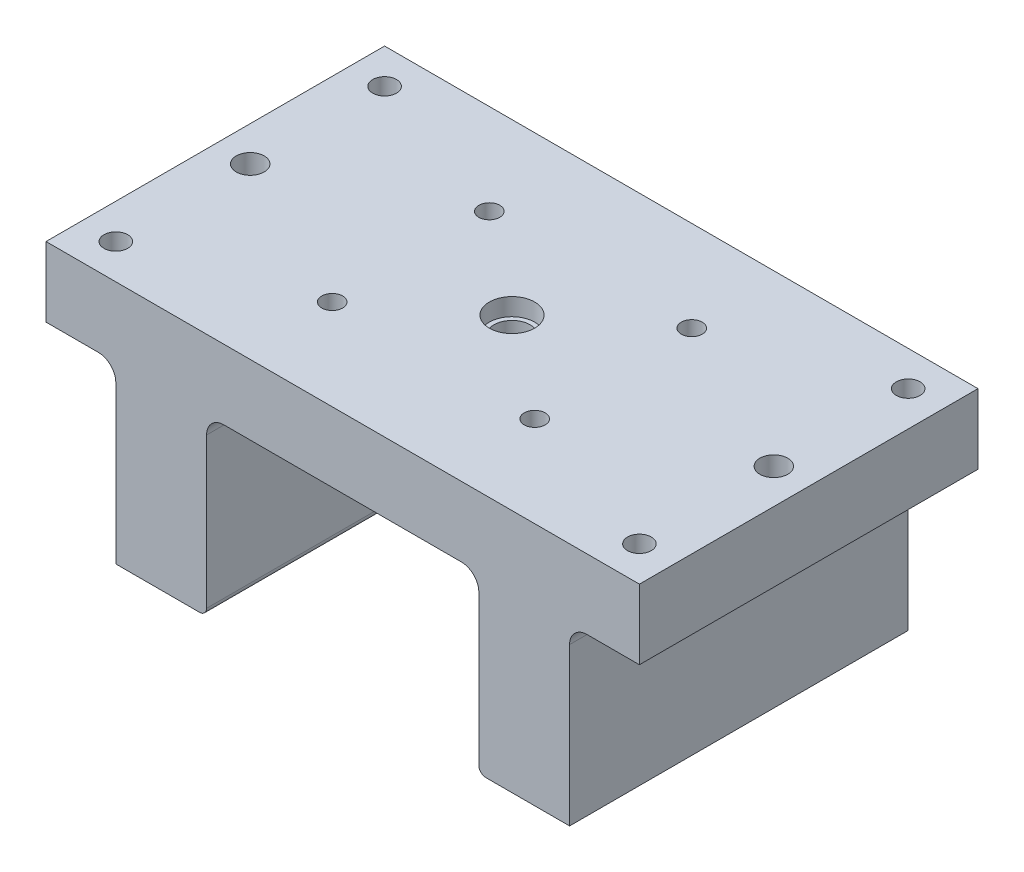
ISO-10303-21;
HEADER;
FILE_DESCRIPTION(('STEP AP214'),'2;1');
FILE_NAME('part.step','',(''),(''),'','','');
FILE_SCHEMA(('AUTOMOTIVE_DESIGN { 1 0 10303 214 1 1 1 1 }'));
ENDSEC;
DATA;
#1=APPLICATION_CONTEXT('core data for automotive mechanical design processes');
#2=APPLICATION_PROTOCOL_DEFINITION('international standard','automotive_design',2000,#1);
#3=PRODUCT_CONTEXT('',#1,'mechanical');
#4=PRODUCT('Part','Part','',(#3));
#5=PRODUCT_RELATED_PRODUCT_CATEGORY('part','',(#4));
#6=PRODUCT_DEFINITION_FORMATION('','',#4);
#7=PRODUCT_DEFINITION_CONTEXT('part definition',#1,'design');
#8=PRODUCT_DEFINITION('design','',#6,#7);
#9=PRODUCT_DEFINITION_SHAPE('','',#8);
#10=(LENGTH_UNIT() NAMED_UNIT(*) SI_UNIT(.MILLI.,.METRE.));
#11=(NAMED_UNIT(*) PLANE_ANGLE_UNIT() SI_UNIT($,.RADIAN.));
#12=(NAMED_UNIT(*) SI_UNIT($,.STERADIAN.) SOLID_ANGLE_UNIT());
#13=UNCERTAINTY_MEASURE_WITH_UNIT(LENGTH_MEASURE(1.E-05),#10,'distance_accuracy_value','');
#14=(GEOMETRIC_REPRESENTATION_CONTEXT(3) GLOBAL_UNCERTAINTY_ASSIGNED_CONTEXT((#13)) GLOBAL_UNIT_ASSIGNED_CONTEXT((#10,
#11,#12)) REPRESENTATION_CONTEXT('',''));
#15=CARTESIAN_POINT('',(0.,0.,0.));
#16=DIRECTION('',(0.,0.,1.));
#17=DIRECTION('',(1.,0.,0.));
#18=AXIS2_PLACEMENT_3D('',#15,#16,#17);
#19=CARTESIAN_POINT('',(65.,70.,48.5));
#20=DIRECTION('',(-1.,0.,0.));
#21=DIRECTION('',(0.,0.,1.));
#22=AXIS2_PLACEMENT_3D('',#19,#20,#21);
#23=PLANE('',#22);
#24=DIRECTION('',(0.,-1.,0.));
#25=VECTOR('',#24,1.);
#26=CARTESIAN_POINT('',(65.,70.,-48.5));
#27=LINE('',#26,#25);
#28=CARTESIAN_POINT('',(65.,45.,-48.5));
#29=VERTEX_POINT('',#28);
#30=CARTESIAN_POINT('',(65.,0.,-48.5));
#31=VERTEX_POINT('',#30);
#32=EDGE_CURVE('E331',#29,#31,#27,.T.);
#33=ORIENTED_EDGE('',*,*,#32,.F.);
#34=DIRECTION('',(0.,0.,-1.));
#35=VECTOR('',#34,1.);
#36=CARTESIAN_POINT('',(65.,45.,48.5));
#37=LINE('',#36,#35);
#38=CARTESIAN_POINT('',(65.,45.,48.5));
#39=VERTEX_POINT('',#38);
#40=EDGE_CURVE('E406',#29,#39,#37,.F.);
#41=ORIENTED_EDGE('',*,*,#40,.T.);
#42=DIRECTION('',(0.,-1.,0.));
#43=VECTOR('',#42,1.);
#44=CARTESIAN_POINT('',(65.,70.,48.5));
#45=LINE('',#44,#43);
#46=CARTESIAN_POINT('',(65.,0.,48.5));
#47=VERTEX_POINT('',#46);
#48=EDGE_CURVE('E334',#39,#47,#45,.T.);
#49=ORIENTED_EDGE('',*,*,#48,.T.);
#50=DIRECTION('',(0.,0.,-1.));
#51=VECTOR('',#50,1.);
#52=CARTESIAN_POINT('',(65.,0.,48.5));
#53=LINE('',#52,#51);
#54=EDGE_CURVE('E314',#47,#31,#53,.T.);
#55=ORIENTED_EDGE('',*,*,#54,.T.);
#56=EDGE_LOOP('',(#33,#41,#49,#55));
#57=FACE_BOUND('',#56,.T.);
#58=ADVANCED_FACE('F53',(#57),#23,.F.);
#59=CARTESIAN_POINT('',(0.,0.,0.));
#60=DIRECTION('',(0.,1.,0.));
#61=DIRECTION('',(0.,0.,1.));
#62=AXIS2_PLACEMENT_3D('',#59,#60,#61);
#63=CYLINDRICAL_SURFACE('',#62,5.2);
#64=CARTESIAN_POINT('',(0.,50.,0.));
#65=DIRECTION('',(0.,1.,0.));
#66=DIRECTION('',(0.,0.,1.));
#67=AXIS2_PLACEMENT_3D('',#64,#65,#66);
#68=CIRCLE('',#67,5.2);
#69=CARTESIAN_POINT('',(0.,50.,5.2));
#70=VERTEX_POINT('',#69);
#71=EDGE_CURVE('E296',#70,#70,#68,.T.);
#72=ORIENTED_EDGE('',*,*,#71,.F.);
#73=EDGE_LOOP('',(#72));
#74=FACE_BOUND('',#73,.T.);
#75=CARTESIAN_POINT('',(0.,65.,0.));
#76=DIRECTION('',(0.,1.,0.));
#77=DIRECTION('',(0.,0.,1.));
#78=AXIS2_PLACEMENT_3D('',#75,#76,#77);
#79=CIRCLE('',#78,5.2);
#80=CARTESIAN_POINT('',(0.,65.,5.2));
#81=VERTEX_POINT('',#80);
#82=EDGE_CURVE('E274',#81,#81,#79,.F.);
#83=ORIENTED_EDGE('',*,*,#82,.F.);
#84=EDGE_LOOP('',(#83));
#85=FACE_BOUND('',#84,.T.);
#86=ADVANCED_FACE('F546',(#74,#85),#63,.F.);
#87=CARTESIAN_POINT('',(0.,0.,0.));
#88=DIRECTION('',(0.,1.,0.));
#89=DIRECTION('',(0.,0.,1.));
#90=AXIS2_PLACEMENT_3D('',#87,#88,#89);
#91=PLANE('',#90);
#92=DIRECTION('',(-1.,0.,0.));
#93=VECTOR('',#92,1.);
#94=CARTESIAN_POINT('',(-65.,0.,-48.5));
#95=LINE('',#94,#93);
#96=CARTESIAN_POINT('',(-41.,0.,-48.5));
#97=VERTEX_POINT('',#96);
#98=CARTESIAN_POINT('',(-65.,0.,-48.5));
#99=VERTEX_POINT('',#98);
#100=EDGE_CURVE('E318',#97,#99,#95,.T.);
#101=ORIENTED_EDGE('',*,*,#100,.F.);
#102=DIRECTION('',(0.,0.,1.));
#103=VECTOR('',#102,1.);
#104=CARTESIAN_POINT('',(-41.,0.,0.));
#105=LINE('',#104,#103);
#106=CARTESIAN_POINT('',(-41.,0.,48.5));
#107=VERTEX_POINT('',#106);
#108=EDGE_CURVE('E390',#97,#107,#105,.T.);
#109=ORIENTED_EDGE('',*,*,#108,.T.);
#110=DIRECTION('',(1.,0.,0.));
#111=VECTOR('',#110,1.);
#112=CARTESIAN_POINT('',(-65.,0.,48.5));
#113=LINE('',#112,#111);
#114=CARTESIAN_POINT('',(-65.,0.,48.5));
#115=VERTEX_POINT('',#114);
#116=EDGE_CURVE('E310',#115,#107,#113,.T.);
#117=ORIENTED_EDGE('',*,*,#116,.F.);
#118=DIRECTION('',(0.,0.,1.));
#119=VECTOR('',#118,1.);
#120=CARTESIAN_POINT('',(-65.,0.,48.5));
#121=LINE('',#120,#119);
#122=EDGE_CURVE('E306',#99,#115,#121,.T.);
#123=ORIENTED_EDGE('',*,*,#122,.F.);
#124=EDGE_LOOP('',(#101,#109,#117,#123));
#125=FACE_BOUND('',#124,.T.);
#126=ADVANCED_FACE('F521',(#125),#91,.F.);
#127=CARTESIAN_POINT('',(-65.,70.,48.5));
#128=DIRECTION('',(0.,0.,-1.));
#129=DIRECTION('',(-1.,0.,0.));
#130=AXIS2_PLACEMENT_3D('',#127,#128,#129);
#131=PLANE('',#130);
#132=DIRECTION('',(0.,1.,0.));
#133=VECTOR('',#132,1.);
#134=CARTESIAN_POINT('',(39.,0.,48.5));
#135=LINE('',#134,#133);
#136=CARTESIAN_POINT('',(39.,2.,48.5));
#137=VERTEX_POINT('',#136);
#138=CARTESIAN_POINT('',(39.,45.,48.5));
#139=VERTEX_POINT('',#138);
#140=EDGE_CURVE('E295',#137,#139,#135,.T.);
#141=ORIENTED_EDGE('',*,*,#140,.F.);
#142=CARTESIAN_POINT('',(41.,2.,48.5));
#143=DIRECTION('',(0.,0.,-1.));
#144=DIRECTION('',(-1.,0.,0.));
#145=AXIS2_PLACEMENT_3D('',#142,#143,#144);
#146=CIRCLE('',#145,2.);
#147=CARTESIAN_POINT('',(41.,0.,48.5));
#148=VERTEX_POINT('',#147);
#149=EDGE_CURVE('E378',#137,#148,#146,.F.);
#150=ORIENTED_EDGE('',*,*,#149,.T.);
#151=EDGE_CURVE('E290',#148,#47,#113,.T.);
#152=ORIENTED_EDGE('',*,*,#151,.T.);
#153=ORIENTED_EDGE('',*,*,#48,.F.);
#154=CARTESIAN_POINT('',(70.,45.,48.5));
#155=DIRECTION('',(0.,0.,-1.));
#156=DIRECTION('',(-1.,0.,0.));
#157=AXIS2_PLACEMENT_3D('',#154,#155,#156);
#158=CIRCLE('',#157,5.);
#159=CARTESIAN_POINT('',(70.,50.,48.5));
#160=VERTEX_POINT('',#159);
#161=EDGE_CURVE('E207',#39,#160,#158,.T.);
#162=ORIENTED_EDGE('',*,*,#161,.T.);
#163=DIRECTION('',(-1.,0.,0.));
#164=VECTOR('',#163,1.);
#165=CARTESIAN_POINT('',(65.,50.,48.5));
#166=LINE('',#165,#164);
#167=CARTESIAN_POINT('',(85.,50.,48.5));
#168=VERTEX_POINT('',#167);
#169=EDGE_CURVE('E184',#168,#160,#166,.T.);
#170=ORIENTED_EDGE('',*,*,#169,.F.);
#171=DIRECTION('',(0.,1.,0.));
#172=VECTOR('',#171,1.);
#173=CARTESIAN_POINT('',(85.,50.,48.5));
#174=LINE('',#173,#172);
#175=CARTESIAN_POINT('',(85.,70.,48.5));
#176=VERTEX_POINT('',#175);
#177=EDGE_CURVE('E195',#168,#176,#174,.T.);
#178=ORIENTED_EDGE('',*,*,#177,.T.);
#179=DIRECTION('',(1.,0.,0.));
#180=VECTOR('',#179,1.);
#181=CARTESIAN_POINT('',(-65.,70.,48.5));
#182=LINE('',#181,#180);
#183=CARTESIAN_POINT('',(-85.,70.,48.5));
#184=VERTEX_POINT('',#183);
#185=EDGE_CURVE('E302',#184,#176,#182,.T.);
#186=ORIENTED_EDGE('',*,*,#185,.F.);
#187=DIRECTION('',(0.,1.,0.));
#188=VECTOR('',#187,1.);
#189=CARTESIAN_POINT('',(-85.,50.,48.5));
#190=LINE('',#189,#188);
#191=CARTESIAN_POINT('',(-85.,50.,48.5));
#192=VERTEX_POINT('',#191);
#193=EDGE_CURVE('E236',#192,#184,#190,.T.);
#194=ORIENTED_EDGE('',*,*,#193,.F.);
#195=DIRECTION('',(1.,0.,0.));
#196=VECTOR('',#195,1.);
#197=CARTESIAN_POINT('',(-65.,50.,48.5));
#198=LINE('',#197,#196);
#199=CARTESIAN_POINT('',(-70.,50.,48.5));
#200=VERTEX_POINT('',#199);
#201=EDGE_CURVE('E229',#192,#200,#198,.T.);
#202=ORIENTED_EDGE('',*,*,#201,.T.);
#203=CARTESIAN_POINT('',(-70.,45.,48.5));
#204=DIRECTION('',(0.,0.,-1.));
#205=DIRECTION('',(-1.,0.,0.));
#206=AXIS2_PLACEMENT_3D('',#203,#204,#205);
#207=CIRCLE('',#206,5.);
#208=CARTESIAN_POINT('',(-65.,45.,48.5));
#209=VERTEX_POINT('',#208);
#210=EDGE_CURVE('E11',#200,#209,#207,.T.);
#211=ORIENTED_EDGE('',*,*,#210,.T.);
#212=DIRECTION('',(0.,-1.,0.));
#213=VECTOR('',#212,1.);
#214=CARTESIAN_POINT('',(-65.,70.,48.5));
#215=LINE('',#214,#213);
#216=EDGE_CURVE('E309',#209,#115,#215,.T.);
#217=ORIENTED_EDGE('',*,*,#216,.T.);
#218=ORIENTED_EDGE('',*,*,#116,.T.);
#219=CARTESIAN_POINT('',(-41.,2.,48.5));
#220=DIRECTION('',(0.,0.,-1.));
#221=DIRECTION('',(-1.,0.,0.));
#222=AXIS2_PLACEMENT_3D('',#219,#220,#221);
#223=CIRCLE('',#222,2.);
#224=CARTESIAN_POINT('',(-39.,2.,48.5));
#225=VERTEX_POINT('',#224);
#226=EDGE_CURVE('E375',#107,#225,#223,.F.);
#227=ORIENTED_EDGE('',*,*,#226,.T.);
#228=DIRECTION('',(0.,-1.,0.));
#229=VECTOR('',#228,1.);
#230=CARTESIAN_POINT('',(-39.,0.,48.5));
#231=LINE('',#230,#229);
#232=CARTESIAN_POINT('',(-39.,45.,48.5));
#233=VERTEX_POINT('',#232);
#234=EDGE_CURVE('E291',#233,#225,#231,.T.);
#235=ORIENTED_EDGE('',*,*,#234,.F.);
#236=CARTESIAN_POINT('',(-34.,45.,48.5));
#237=DIRECTION('',(0.,0.,-1.));
#238=DIRECTION('',(-1.,0.,0.));
#239=AXIS2_PLACEMENT_3D('',#236,#237,#238);
#240=CIRCLE('',#239,5.);
#241=CARTESIAN_POINT('',(-34.,50.,48.5));
#242=VERTEX_POINT('',#241);
#243=EDGE_CURVE('E359',#233,#242,#240,.T.);
#244=ORIENTED_EDGE('',*,*,#243,.T.);
#245=DIRECTION('',(-1.,0.,0.));
#246=VECTOR('',#245,1.);
#247=CARTESIAN_POINT('',(-39.,50.,48.5));
#248=LINE('',#247,#246);
#249=CARTESIAN_POINT('',(34.,50.,48.5));
#250=VERTEX_POINT('',#249);
#251=EDGE_CURVE('E283',#250,#242,#248,.T.);
#252=ORIENTED_EDGE('',*,*,#251,.F.);
#253=CARTESIAN_POINT('',(34.,45.,48.5));
#254=DIRECTION('',(0.,0.,-1.));
#255=DIRECTION('',(-1.,0.,0.));
#256=AXIS2_PLACEMENT_3D('',#253,#254,#255);
#257=CIRCLE('',#256,5.);
#258=EDGE_CURVE('E352',#250,#139,#257,.T.);
#259=ORIENTED_EDGE('',*,*,#258,.T.);
#260=EDGE_LOOP('',(#141,#150,#152,#153,#162,#170,#178,#186,#194,#202,#211,#217,#218,#227,#235,
#244,#252,#259));
#261=FACE_BOUND('',#260,.T.);
#262=ADVANCED_FACE('F204',(#261),#131,.F.);
#263=CARTESIAN_POINT('',(-65.,70.,-48.5));
#264=DIRECTION('',(0.,0.,1.));
#265=DIRECTION('',(1.,0.,0.));
#266=AXIS2_PLACEMENT_3D('',#263,#264,#265);
#267=PLANE('',#266);
#268=CARTESIAN_POINT('',(41.,0.,-48.5));
#269=VERTEX_POINT('',#268);
#270=EDGE_CURVE('E319',#31,#269,#95,.T.);
#271=ORIENTED_EDGE('',*,*,#270,.T.);
#272=CARTESIAN_POINT('',(41.,2.,-48.5));
#273=DIRECTION('',(0.,0.,1.));
#274=DIRECTION('',(1.,0.,0.));
#275=AXIS2_PLACEMENT_3D('',#272,#273,#274);
#276=CIRCLE('',#275,2.);
#277=CARTESIAN_POINT('',(39.,2.,-48.5));
#278=VERTEX_POINT('',#277);
#279=EDGE_CURVE('E387',#269,#278,#276,.F.);
#280=ORIENTED_EDGE('',*,*,#279,.T.);
#281=DIRECTION('',(0.,1.,0.));
#282=VECTOR('',#281,1.);
#283=CARTESIAN_POINT('',(39.,0.,-48.5));
#284=LINE('',#283,#282);
#285=CARTESIAN_POINT('',(39.,45.,-48.5));
#286=VERTEX_POINT('',#285);
#287=EDGE_CURVE('E282',#278,#286,#284,.T.);
#288=ORIENTED_EDGE('',*,*,#287,.T.);
#289=CARTESIAN_POINT('',(34.,45.,-48.5));
#290=DIRECTION('',(0.,0.,1.));
#291=DIRECTION('',(1.,0.,0.));
#292=AXIS2_PLACEMENT_3D('',#289,#290,#291);
#293=CIRCLE('',#292,5.);
#294=CARTESIAN_POINT('',(34.,50.,-48.5));
#295=VERTEX_POINT('',#294);
#296=EDGE_CURVE('E356',#286,#295,#293,.T.);
#297=ORIENTED_EDGE('',*,*,#296,.T.);
#298=DIRECTION('',(-1.,0.,0.));
#299=VECTOR('',#298,1.);
#300=CARTESIAN_POINT('',(-39.,50.,-48.5));
#301=LINE('',#300,#299);
#302=CARTESIAN_POINT('',(-34.,50.,-48.5));
#303=VERTEX_POINT('',#302);
#304=EDGE_CURVE('E286',#295,#303,#301,.T.);
#305=ORIENTED_EDGE('',*,*,#304,.T.);
#306=CARTESIAN_POINT('',(-34.,45.,-48.5));
#307=DIRECTION('',(0.,0.,1.));
#308=DIRECTION('',(1.,0.,0.));
#309=AXIS2_PLACEMENT_3D('',#306,#307,#308);
#310=CIRCLE('',#309,5.);
#311=CARTESIAN_POINT('',(-39.,45.,-48.5));
#312=VERTEX_POINT('',#311);
#313=EDGE_CURVE('E362',#303,#312,#310,.T.);
#314=ORIENTED_EDGE('',*,*,#313,.T.);
#315=DIRECTION('',(0.,-1.,0.));
#316=VECTOR('',#315,1.);
#317=CARTESIAN_POINT('',(-39.,0.,-48.5));
#318=LINE('',#317,#316);
#319=CARTESIAN_POINT('',(-39.,2.,-48.5));
#320=VERTEX_POINT('',#319);
#321=EDGE_CURVE('E278',#312,#320,#318,.T.);
#322=ORIENTED_EDGE('',*,*,#321,.T.);
#323=CARTESIAN_POINT('',(-41.,2.,-48.5));
#324=DIRECTION('',(0.,0.,1.));
#325=DIRECTION('',(1.,0.,0.));
#326=AXIS2_PLACEMENT_3D('',#323,#324,#325);
#327=CIRCLE('',#326,2.);
#328=EDGE_CURVE('E384',#320,#97,#327,.F.);
#329=ORIENTED_EDGE('',*,*,#328,.T.);
#330=ORIENTED_EDGE('',*,*,#100,.T.);
#331=DIRECTION('',(0.,-1.,0.));
#332=VECTOR('',#331,1.);
#333=CARTESIAN_POINT('',(-65.,70.,-48.5));
#334=LINE('',#333,#332);
#335=CARTESIAN_POINT('',(-65.,45.,-48.5));
#336=VERTEX_POINT('',#335);
#337=EDGE_CURVE('E328',#336,#99,#334,.T.);
#338=ORIENTED_EDGE('',*,*,#337,.F.);
#339=CARTESIAN_POINT('',(-70.,45.,-48.5));
#340=DIRECTION('',(0.,0.,1.));
#341=DIRECTION('',(1.,0.,0.));
#342=AXIS2_PLACEMENT_3D('',#339,#340,#341);
#343=CIRCLE('',#342,5.);
#344=CARTESIAN_POINT('',(-70.,50.,-48.5));
#345=VERTEX_POINT('',#344);
#346=EDGE_CURVE('E63',#336,#345,#343,.T.);
#347=ORIENTED_EDGE('',*,*,#346,.T.);
#348=DIRECTION('',(-1.,0.,0.));
#349=VECTOR('',#348,1.);
#350=CARTESIAN_POINT('',(-65.,50.,-48.5));
#351=LINE('',#350,#349);
#352=CARTESIAN_POINT('',(-85.,50.,-48.5));
#353=VERTEX_POINT('',#352);
#354=EDGE_CURVE('E222',#345,#353,#351,.T.);
#355=ORIENTED_EDGE('',*,*,#354,.T.);
#356=DIRECTION('',(0.,1.,0.));
#357=VECTOR('',#356,1.);
#358=CARTESIAN_POINT('',(-85.,50.,-48.5));
#359=LINE('',#358,#357);
#360=CARTESIAN_POINT('',(-85.,70.,-48.5));
#361=VERTEX_POINT('',#360);
#362=EDGE_CURVE('E232',#353,#361,#359,.T.);
#363=ORIENTED_EDGE('',*,*,#362,.T.);
#364=DIRECTION('',(-1.,0.,0.));
#365=VECTOR('',#364,1.);
#366=CARTESIAN_POINT('',(-65.,70.,-48.5));
#367=LINE('',#366,#365);
#368=CARTESIAN_POINT('',(85.,70.,-48.5));
#369=VERTEX_POINT('',#368);
#370=EDGE_CURVE('E305',#369,#361,#367,.T.);
#371=ORIENTED_EDGE('',*,*,#370,.F.);
#372=DIRECTION('',(0.,1.,0.));
#373=VECTOR('',#372,1.);
#374=CARTESIAN_POINT('',(85.,50.,-48.5));
#375=LINE('',#374,#373);
#376=CARTESIAN_POINT('',(85.,50.,-48.5));
#377=VERTEX_POINT('',#376);
#378=EDGE_CURVE('E201',#377,#369,#375,.T.);
#379=ORIENTED_EDGE('',*,*,#378,.F.);
#380=DIRECTION('',(1.,0.,0.));
#381=VECTOR('',#380,1.);
#382=CARTESIAN_POINT('',(65.,50.,-48.5));
#383=LINE('',#382,#381);
#384=CARTESIAN_POINT('',(70.,50.,-48.5));
#385=VERTEX_POINT('',#384);
#386=EDGE_CURVE('E187',#385,#377,#383,.T.);
#387=ORIENTED_EDGE('',*,*,#386,.F.);
#388=CARTESIAN_POINT('',(70.,45.,-48.5));
#389=DIRECTION('',(0.,0.,1.));
#390=DIRECTION('',(1.,0.,0.));
#391=AXIS2_PLACEMENT_3D('',#388,#389,#390);
#392=CIRCLE('',#391,5.);
#393=EDGE_CURVE('E415',#385,#29,#392,.T.);
#394=ORIENTED_EDGE('',*,*,#393,.T.);
#395=ORIENTED_EDGE('',*,*,#32,.T.);
#396=EDGE_LOOP('',(#271,#280,#288,#297,#305,#314,#322,#329,#330,#338,#347,#355,#363,#371,#379,
#387,#394,#395));
#397=FACE_BOUND('',#396,.T.);
#398=ADVANCED_FACE('F500',(#397),#267,.F.);
#399=CARTESIAN_POINT('',(-65.,70.,48.5));
#400=DIRECTION('',(1.,0.,0.));
#401=DIRECTION('',(0.,0.,-1.));
#402=AXIS2_PLACEMENT_3D('',#399,#400,#401);
#403=PLANE('',#402);
#404=ORIENTED_EDGE('',*,*,#216,.F.);
#405=DIRECTION('',(0.,0.,-1.));
#406=VECTOR('',#405,1.);
#407=CARTESIAN_POINT('',(-65.,45.,-48.5));
#408=LINE('',#407,#406);
#409=EDGE_CURVE('E409',#209,#336,#408,.T.);
#410=ORIENTED_EDGE('',*,*,#409,.T.);
#411=ORIENTED_EDGE('',*,*,#337,.T.);
#412=ORIENTED_EDGE('',*,*,#122,.T.);
#413=EDGE_LOOP('',(#404,#410,#411,#412));
#414=FACE_BOUND('',#413,.T.);
#415=ADVANCED_FACE('F514',(#414),#403,.F.);
#416=CARTESIAN_POINT('',(0.,70.,0.));
#417=DIRECTION('',(0.,1.,0.));
#418=DIRECTION('',(0.,0.,1.));
#419=AXIS2_PLACEMENT_3D('',#416,#417,#418);
#420=PLANE('',#419);
#421=CARTESIAN_POINT('',(-75.,70.,0.));
#422=DIRECTION('',(0.,1.,0.));
#423=DIRECTION('',(0.,0.,1.));
#424=AXIS2_PLACEMENT_3D('',#421,#422,#423);
#425=CIRCLE('',#424,4.);
#426=CARTESIAN_POINT('',(-75.,70.,4.00000000000001));
#427=VERTEX_POINT('',#426);
#428=EDGE_CURVE('E799',#427,#427,#425,.T.);
#429=ORIENTED_EDGE('',*,*,#428,.F.);
#430=EDGE_LOOP('',(#429));
#431=FACE_BOUND('',#430,.T.);
#432=CARTESIAN_POINT('',(75.,70.,0.));
#433=DIRECTION('',(0.,1.,0.));
#434=DIRECTION('',(0.,0.,1.));
#435=AXIS2_PLACEMENT_3D('',#432,#433,#434);
#436=CIRCLE('',#435,4.);
#437=CARTESIAN_POINT('',(75.,70.,4.00000000000001));
#438=VERTEX_POINT('',#437);
#439=EDGE_CURVE('E804',#438,#438,#436,.T.);
#440=ORIENTED_EDGE('',*,*,#439,.F.);
#441=EDGE_LOOP('',(#440));
#442=FACE_BOUND('',#441,.T.);
#443=CARTESIAN_POINT('',(-75.,70.,-38.5));
#444=DIRECTION('',(0.,1.,0.));
#445=DIRECTION('',(0.,0.,1.));
#446=AXIS2_PLACEMENT_3D('',#443,#444,#445);
#447=CIRCLE('',#446,3.4);
#448=CARTESIAN_POINT('',(-75.,70.,-35.1));
#449=VERTEX_POINT('',#448);
#450=EDGE_CURVE('E817',#449,#449,#447,.T.);
#451=ORIENTED_EDGE('',*,*,#450,.F.);
#452=EDGE_LOOP('',(#451));
#453=FACE_BOUND('',#452,.T.);
#454=CARTESIAN_POINT('',(-75.,70.,38.5));
#455=DIRECTION('',(0.,1.,0.));
#456=DIRECTION('',(0.,0.,1.));
#457=AXIS2_PLACEMENT_3D('',#454,#455,#456);
#458=CIRCLE('',#457,3.4);
#459=CARTESIAN_POINT('',(-75.,70.,41.9));
#460=VERTEX_POINT('',#459);
#461=EDGE_CURVE('E821',#460,#460,#458,.T.);
#462=ORIENTED_EDGE('',*,*,#461,.F.);
#463=EDGE_LOOP('',(#462));
#464=FACE_BOUND('',#463,.T.);
#465=CARTESIAN_POINT('',(75.,70.,38.5));
#466=DIRECTION('',(0.,1.,0.));
#467=DIRECTION('',(0.,0.,1.));
#468=AXIS2_PLACEMENT_3D('',#465,#466,#467);
#469=CIRCLE('',#468,3.4);
#470=CARTESIAN_POINT('',(75.,70.,41.9));
#471=VERTEX_POINT('',#470);
#472=EDGE_CURVE('E829',#471,#471,#469,.T.);
#473=ORIENTED_EDGE('',*,*,#472,.F.);
#474=EDGE_LOOP('',(#473));
#475=FACE_BOUND('',#474,.T.);
#476=CARTESIAN_POINT('',(75.,70.,-38.5));
#477=DIRECTION('',(0.,1.,0.));
#478=DIRECTION('',(0.,0.,1.));
#479=AXIS2_PLACEMENT_3D('',#476,#477,#478);
#480=CIRCLE('',#479,3.4);
#481=CARTESIAN_POINT('',(75.,70.,-35.1));
#482=VERTEX_POINT('',#481);
#483=EDGE_CURVE('E836',#482,#482,#480,.T.);
#484=ORIENTED_EDGE('',*,*,#483,.F.);
#485=EDGE_LOOP('',(#484));
#486=FACE_BOUND('',#485,.T.);
#487=CARTESIAN_POINT('',(-29.,70.,-22.5));
#488=DIRECTION('',(0.,1.,0.));
#489=DIRECTION('',(0.,0.,1.));
#490=AXIS2_PLACEMENT_3D('',#487,#488,#489);
#491=CIRCLE('',#490,2.99999999999999);
#492=CARTESIAN_POINT('',(-29.,70.,-19.5));
#493=VERTEX_POINT('',#492);
#494=EDGE_CURVE('E240',#493,#493,#491,.T.);
#495=ORIENTED_EDGE('',*,*,#494,.F.);
#496=EDGE_LOOP('',(#495));
#497=FACE_BOUND('',#496,.T.);
#498=CARTESIAN_POINT('',(29.,70.,-22.5));
#499=DIRECTION('',(0.,1.,0.));
#500=DIRECTION('',(0.,0.,1.));
#501=AXIS2_PLACEMENT_3D('',#498,#499,#500);
#502=CIRCLE('',#501,2.99999999999999);
#503=CARTESIAN_POINT('',(29.,70.,-19.5));
#504=VERTEX_POINT('',#503);
#505=EDGE_CURVE('E248',#504,#504,#502,.T.);
#506=ORIENTED_EDGE('',*,*,#505,.F.);
#507=EDGE_LOOP('',(#506));
#508=FACE_BOUND('',#507,.T.);
#509=CARTESIAN_POINT('',(29.,70.,22.5));
#510=DIRECTION('',(0.,1.,0.));
#511=DIRECTION('',(0.,0.,1.));
#512=AXIS2_PLACEMENT_3D('',#509,#510,#511);
#513=CIRCLE('',#512,2.99999999999999);
#514=CARTESIAN_POINT('',(29.,70.,25.5));
#515=VERTEX_POINT('',#514);
#516=EDGE_CURVE('E253',#515,#515,#513,.T.);
#517=ORIENTED_EDGE('',*,*,#516,.F.);
#518=EDGE_LOOP('',(#517));
#519=FACE_BOUND('',#518,.T.);
#520=CARTESIAN_POINT('',(-29.,70.,22.5));
#521=DIRECTION('',(0.,1.,0.));
#522=DIRECTION('',(0.,0.,1.));
#523=AXIS2_PLACEMENT_3D('',#520,#521,#522);
#524=CIRCLE('',#523,2.99999999999999);
#525=CARTESIAN_POINT('',(-29.,70.,25.5));
#526=VERTEX_POINT('',#525);
#527=EDGE_CURVE('E261',#526,#526,#524,.T.);
#528=ORIENTED_EDGE('',*,*,#527,.F.);
#529=EDGE_LOOP('',(#528));
#530=FACE_BOUND('',#529,.T.);
#531=CARTESIAN_POINT('',(0.,70.,0.));
#532=DIRECTION('',(0.,1.,0.));
#533=DIRECTION('',(0.,0.,1.));
#534=AXIS2_PLACEMENT_3D('',#531,#532,#533);
#535=CIRCLE('',#534,6.5);
#536=CARTESIAN_POINT('',(0.,70.,6.5));
#537=VERTEX_POINT('',#536);
#538=EDGE_CURVE('E269',#537,#537,#535,.T.);
#539=ORIENTED_EDGE('',*,*,#538,.F.);
#540=EDGE_LOOP('',(#539));
#541=FACE_BOUND('',#540,.T.);
#542=ORIENTED_EDGE('',*,*,#185,.T.);
#543=DIRECTION('',(0.,0.,1.));
#544=VECTOR('',#543,1.);
#545=CARTESIAN_POINT('',(85.,70.,48.5));
#546=LINE('',#545,#544);
#547=EDGE_CURVE('E198',#369,#176,#546,.T.);
#548=ORIENTED_EDGE('',*,*,#547,.F.);
#549=ORIENTED_EDGE('',*,*,#370,.T.);
#550=DIRECTION('',(0.,0.,1.));
#551=VECTOR('',#550,1.);
#552=CARTESIAN_POINT('',(-85.,70.,48.5));
#553=LINE('',#552,#551);
#554=EDGE_CURVE('E220',#361,#184,#553,.T.);
#555=ORIENTED_EDGE('',*,*,#554,.T.);
#556=EDGE_LOOP('',(#542,#548,#549,#555));
#557=FACE_BOUND('',#556,.T.);
#558=ADVANCED_FACE('F502',(#431,#442,#453,#464,#475,#486,#497,#508,#519,#530,#541,#557),#420,.T.);
#559=ORIENTED_EDGE('',*,*,#151,.F.);
#560=DIRECTION('',(0.,0.,1.));
#561=VECTOR('',#560,1.);
#562=CARTESIAN_POINT('',(41.,0.,0.));
#563=LINE('',#562,#561);
#564=EDGE_CURVE('E381',#148,#269,#563,.F.);
#565=ORIENTED_EDGE('',*,*,#564,.T.);
#566=ORIENTED_EDGE('',*,*,#270,.F.);
#567=ORIENTED_EDGE('',*,*,#54,.F.);
#568=EDGE_LOOP('',(#559,#565,#566,#567));
#569=FACE_BOUND('',#568,.T.);
#570=ADVANCED_FACE('F494',(#569),#91,.F.);
#571=CARTESIAN_POINT('',(-39.,0.,-48.5));
#572=DIRECTION('',(-1.,0.,0.));
#573=DIRECTION('',(0.,0.,1.));
#574=AXIS2_PLACEMENT_3D('',#571,#572,#573);
#575=PLANE('',#574);
#576=ORIENTED_EDGE('',*,*,#234,.T.);
#577=DIRECTION('',(0.,0.,1.));
#578=VECTOR('',#577,1.);
#579=CARTESIAN_POINT('',(-39.,2.,-48.5));
#580=LINE('',#579,#578);
#581=EDGE_CURVE('E394',#225,#320,#580,.F.);
#582=ORIENTED_EDGE('',*,*,#581,.T.);
#583=ORIENTED_EDGE('',*,*,#321,.F.);
#584=DIRECTION('',(0.,0.,1.));
#585=VECTOR('',#584,1.);
#586=CARTESIAN_POINT('',(-39.,45.,48.5));
#587=LINE('',#586,#585);
#588=EDGE_CURVE('E348',#312,#233,#587,.T.);
#589=ORIENTED_EDGE('',*,*,#588,.T.);
#590=EDGE_LOOP('',(#576,#582,#583,#589));
#591=FACE_BOUND('',#590,.T.);
#592=ADVANCED_FACE('F526',(#591),#575,.F.);
#593=CARTESIAN_POINT('',(-39.,50.,-48.5));
#594=DIRECTION('',(0.,1.,0.));
#595=DIRECTION('',(0.,0.,1.));
#596=AXIS2_PLACEMENT_3D('',#593,#594,#595);
#597=PLANE('',#596);
#598=CARTESIAN_POINT('',(-29.,50.,-22.5));
#599=DIRECTION('',(0.,1.,0.));
#600=DIRECTION('',(0.,0.,1.));
#601=AXIS2_PLACEMENT_3D('',#598,#599,#600);
#602=CIRCLE('',#601,2.99999999999999);
#603=CARTESIAN_POINT('',(-29.,50.,-19.5));
#604=VERTEX_POINT('',#603);
#605=EDGE_CURVE('E247',#604,#604,#602,.T.);
#606=ORIENTED_EDGE('',*,*,#605,.T.);
#607=EDGE_LOOP('',(#606));
#608=FACE_BOUND('',#607,.T.);
#609=CARTESIAN_POINT('',(29.,50.,-22.5));
#610=DIRECTION('',(0.,1.,0.));
#611=DIRECTION('',(0.,0.,1.));
#612=AXIS2_PLACEMENT_3D('',#609,#610,#611);
#613=CIRCLE('',#612,2.99999999999999);
#614=CARTESIAN_POINT('',(29.,50.,-19.5));
#615=VERTEX_POINT('',#614);
#616=EDGE_CURVE('E252',#615,#615,#613,.T.);
#617=ORIENTED_EDGE('',*,*,#616,.T.);
#618=EDGE_LOOP('',(#617));
#619=FACE_BOUND('',#618,.T.);
#620=CARTESIAN_POINT('',(29.,50.,22.5));
#621=DIRECTION('',(0.,1.,0.));
#622=DIRECTION('',(0.,0.,1.));
#623=AXIS2_PLACEMENT_3D('',#620,#621,#622);
#624=CIRCLE('',#623,2.99999999999999);
#625=CARTESIAN_POINT('',(29.,50.,25.5));
#626=VERTEX_POINT('',#625);
#627=EDGE_CURVE('E257',#626,#626,#624,.T.);
#628=ORIENTED_EDGE('',*,*,#627,.T.);
#629=EDGE_LOOP('',(#628));
#630=FACE_BOUND('',#629,.T.);
#631=CARTESIAN_POINT('',(-29.,50.,22.5));
#632=DIRECTION('',(0.,1.,0.));
#633=DIRECTION('',(0.,0.,1.));
#634=AXIS2_PLACEMENT_3D('',#631,#632,#633);
#635=CIRCLE('',#634,2.99999999999999);
#636=CARTESIAN_POINT('',(-29.,50.,25.5));
#637=VERTEX_POINT('',#636);
#638=EDGE_CURVE('E265',#637,#637,#635,.T.);
#639=ORIENTED_EDGE('',*,*,#638,.T.);
#640=EDGE_LOOP('',(#639));
#641=FACE_BOUND('',#640,.T.);
#642=ORIENTED_EDGE('',*,*,#71,.T.);
#643=EDGE_LOOP('',(#642));
#644=FACE_BOUND('',#643,.T.);
#645=ORIENTED_EDGE('',*,*,#304,.F.);
#646=DIRECTION('',(0.,0.,1.));
#647=VECTOR('',#646,1.);
#648=CARTESIAN_POINT('',(34.,50.,48.5));
#649=LINE('',#648,#647);
#650=EDGE_CURVE('E340',#295,#250,#649,.T.);
#651=ORIENTED_EDGE('',*,*,#650,.T.);
#652=ORIENTED_EDGE('',*,*,#251,.T.);
#653=DIRECTION('',(0.,0.,1.));
#654=VECTOR('',#653,1.);
#655=CARTESIAN_POINT('',(-34.,50.,-48.5));
#656=LINE('',#655,#654);
#657=EDGE_CURVE('E337',#242,#303,#656,.F.);
#658=ORIENTED_EDGE('',*,*,#657,.T.);
#659=EDGE_LOOP('',(#645,#651,#652,#658));
#660=FACE_BOUND('',#659,.T.);
#661=ADVANCED_FACE('F579',(#608,#619,#630,#641,#644,#660),#597,.F.);
#662=CARTESIAN_POINT('',(39.,0.,-48.5));
#663=DIRECTION('',(1.,0.,0.));
#664=DIRECTION('',(0.,0.,-1.));
#665=AXIS2_PLACEMENT_3D('',#662,#663,#664);
#666=PLANE('',#665);
#667=ORIENTED_EDGE('',*,*,#287,.F.);
#668=DIRECTION('',(0.,0.,1.));
#669=VECTOR('',#668,1.);
#670=CARTESIAN_POINT('',(39.,2.,-48.5));
#671=LINE('',#670,#669);
#672=EDGE_CURVE('E365',#278,#137,#671,.T.);
#673=ORIENTED_EDGE('',*,*,#672,.T.);
#674=ORIENTED_EDGE('',*,*,#140,.T.);
#675=DIRECTION('',(0.,0.,1.));
#676=VECTOR('',#675,1.);
#677=CARTESIAN_POINT('',(39.,45.,-48.5));
#678=LINE('',#677,#676);
#679=EDGE_CURVE('E344',#139,#286,#678,.F.);
#680=ORIENTED_EDGE('',*,*,#679,.T.);
#681=EDGE_LOOP('',(#667,#673,#674,#680));
#682=FACE_BOUND('',#681,.T.);
#683=ADVANCED_FACE('F563',(#682),#666,.F.);
#684=CARTESIAN_POINT('',(34.,45.,-48.5));
#685=DIRECTION('',(0.,0.,-1.));
#686=DIRECTION('',(-1.,0.,0.));
#687=AXIS2_PLACEMENT_3D('',#684,#685,#686);
#688=CYLINDRICAL_SURFACE('',#687,5.);
#689=ORIENTED_EDGE('',*,*,#296,.F.);
#690=ORIENTED_EDGE('',*,*,#679,.F.);
#691=ORIENTED_EDGE('',*,*,#258,.F.);
#692=ORIENTED_EDGE('',*,*,#650,.F.);
#693=EDGE_LOOP('',(#689,#690,#691,#692));
#694=FACE_BOUND('',#693,.T.);
#695=ADVANCED_FACE('F559',(#694),#688,.F.);
#696=CARTESIAN_POINT('',(-34.,45.,-48.5));
#697=DIRECTION('',(0.,0.,-1.));
#698=DIRECTION('',(-1.,0.,0.));
#699=AXIS2_PLACEMENT_3D('',#696,#697,#698);
#700=CYLINDRICAL_SURFACE('',#699,5.);
#701=ORIENTED_EDGE('',*,*,#313,.F.);
#702=ORIENTED_EDGE('',*,*,#657,.F.);
#703=ORIENTED_EDGE('',*,*,#243,.F.);
#704=ORIENTED_EDGE('',*,*,#588,.F.);
#705=EDGE_LOOP('',(#701,#702,#703,#704));
#706=FACE_BOUND('',#705,.T.);
#707=ADVANCED_FACE('F562',(#706),#700,.F.);
#708=CARTESIAN_POINT('',(0.,65.,0.));
#709=DIRECTION('',(0.,1.,0.));
#710=DIRECTION('',(0.,0.,1.));
#711=AXIS2_PLACEMENT_3D('',#708,#709,#710);
#712=PLANE('',#711);
#713=CARTESIAN_POINT('',(0.,65.,0.));
#714=DIRECTION('',(0.,1.,0.));
#715=DIRECTION('',(0.,0.,1.));
#716=AXIS2_PLACEMENT_3D('',#713,#714,#715);
#717=CIRCLE('',#716,6.5);
#718=CARTESIAN_POINT('',(0.,65.,6.5));
#719=VERTEX_POINT('',#718);
#720=EDGE_CURVE('E270',#719,#719,#717,.T.);
#721=ORIENTED_EDGE('',*,*,#720,.T.);
#722=EDGE_LOOP('',(#721));
#723=FACE_BOUND('',#722,.T.);
#724=ORIENTED_EDGE('',*,*,#82,.T.);
#725=EDGE_LOOP('',(#724));
#726=FACE_BOUND('',#725,.T.);
#727=ADVANCED_FACE('F566',(#723,#726),#712,.T.);
#728=CARTESIAN_POINT('',(0.,65.,0.));
#729=DIRECTION('',(0.,1.,0.));
#730=DIRECTION('',(0.,0.,1.));
#731=AXIS2_PLACEMENT_3D('',#728,#729,#730);
#732=CYLINDRICAL_SURFACE('',#731,6.5);
#733=ORIENTED_EDGE('',*,*,#720,.F.);
#734=EDGE_LOOP('',(#733));
#735=FACE_BOUND('',#734,.T.);
#736=ORIENTED_EDGE('',*,*,#538,.T.);
#737=EDGE_LOOP('',(#736));
#738=FACE_BOUND('',#737,.T.);
#739=ADVANCED_FACE('F542',(#735,#738),#732,.F.);
#740=CARTESIAN_POINT('',(41.,2.,-48.5));
#741=DIRECTION('',(0.,0.,1.));
#742=DIRECTION('',(1.,0.,0.));
#743=AXIS2_PLACEMENT_3D('',#740,#741,#742);
#744=CYLINDRICAL_SURFACE('',#743,2.);
#745=ORIENTED_EDGE('',*,*,#279,.F.);
#746=ORIENTED_EDGE('',*,*,#564,.F.);
#747=ORIENTED_EDGE('',*,*,#149,.F.);
#748=ORIENTED_EDGE('',*,*,#672,.F.);
#749=EDGE_LOOP('',(#745,#746,#747,#748));
#750=FACE_BOUND('',#749,.T.);
#751=ADVANCED_FACE('F532',(#750),#744,.T.);
#752=CARTESIAN_POINT('',(-41.,2.,0.));
#753=DIRECTION('',(0.,0.,1.));
#754=DIRECTION('',(1.,0.,0.));
#755=AXIS2_PLACEMENT_3D('',#752,#753,#754);
#756=CYLINDRICAL_SURFACE('',#755,2.);
#757=ORIENTED_EDGE('',*,*,#328,.F.);
#758=ORIENTED_EDGE('',*,*,#581,.F.);
#759=ORIENTED_EDGE('',*,*,#226,.F.);
#760=ORIENTED_EDGE('',*,*,#108,.F.);
#761=EDGE_LOOP('',(#757,#758,#759,#760));
#762=FACE_BOUND('',#761,.T.);
#763=ADVANCED_FACE('F529',(#762),#756,.T.);
#764=CARTESIAN_POINT('',(-29.,70.,22.5));
#765=DIRECTION('',(0.,1.,0.));
#766=DIRECTION('',(0.,0.,1.));
#767=AXIS2_PLACEMENT_3D('',#764,#765,#766);
#768=CYLINDRICAL_SURFACE('',#767,2.99999999999999);
#769=ORIENTED_EDGE('',*,*,#527,.T.);
#770=EDGE_LOOP('',(#769));
#771=FACE_BOUND('',#770,.T.);
#772=ORIENTED_EDGE('',*,*,#638,.F.);
#773=EDGE_LOOP('',(#772));
#774=FACE_BOUND('',#773,.T.);
#775=ADVANCED_FACE('F531',(#771,#774),#768,.F.);
#776=CARTESIAN_POINT('',(29.,70.,22.5));
#777=DIRECTION('',(0.,1.,0.));
#778=DIRECTION('',(0.,0.,1.));
#779=AXIS2_PLACEMENT_3D('',#776,#777,#778);
#780=CYLINDRICAL_SURFACE('',#779,2.99999999999999);
#781=ORIENTED_EDGE('',*,*,#516,.T.);
#782=EDGE_LOOP('',(#781));
#783=FACE_BOUND('',#782,.T.);
#784=ORIENTED_EDGE('',*,*,#627,.F.);
#785=EDGE_LOOP('',(#784));
#786=FACE_BOUND('',#785,.T.);
#787=ADVANCED_FACE('F539',(#783,#786),#780,.F.);
#788=CARTESIAN_POINT('',(29.,70.,-22.5));
#789=DIRECTION('',(0.,1.,0.));
#790=DIRECTION('',(0.,0.,1.));
#791=AXIS2_PLACEMENT_3D('',#788,#789,#790);
#792=CYLINDRICAL_SURFACE('',#791,2.99999999999999);
#793=ORIENTED_EDGE('',*,*,#505,.T.);
#794=EDGE_LOOP('',(#793));
#795=FACE_BOUND('',#794,.T.);
#796=ORIENTED_EDGE('',*,*,#616,.F.);
#797=EDGE_LOOP('',(#796));
#798=FACE_BOUND('',#797,.T.);
#799=ADVANCED_FACE('F744',(#795,#798),#792,.F.);
#800=CARTESIAN_POINT('',(-29.,70.,-22.5));
#801=DIRECTION('',(0.,1.,0.));
#802=DIRECTION('',(0.,0.,1.));
#803=AXIS2_PLACEMENT_3D('',#800,#801,#802);
#804=CYLINDRICAL_SURFACE('',#803,2.99999999999999);
#805=ORIENTED_EDGE('',*,*,#494,.T.);
#806=EDGE_LOOP('',(#805));
#807=FACE_BOUND('',#806,.T.);
#808=ORIENTED_EDGE('',*,*,#605,.F.);
#809=EDGE_LOOP('',(#808));
#810=FACE_BOUND('',#809,.T.);
#811=ADVANCED_FACE('F640',(#807,#810),#804,.F.);
#812=CARTESIAN_POINT('',(-85.,50.,48.5));
#813=DIRECTION('',(-1.,0.,0.));
#814=DIRECTION('',(0.,0.,1.));
#815=AXIS2_PLACEMENT_3D('',#812,#813,#814);
#816=PLANE('',#815);
#817=ORIENTED_EDGE('',*,*,#554,.F.);
#818=ORIENTED_EDGE('',*,*,#362,.F.);
#819=DIRECTION('',(0.,0.,1.));
#820=VECTOR('',#819,1.);
#821=CARTESIAN_POINT('',(-85.,50.,48.5));
#822=LINE('',#821,#820);
#823=EDGE_CURVE('E225',#353,#192,#822,.T.);
#824=ORIENTED_EDGE('',*,*,#823,.T.);
#825=ORIENTED_EDGE('',*,*,#193,.T.);
#826=EDGE_LOOP('',(#817,#818,#824,#825));
#827=FACE_BOUND('',#826,.T.);
#828=ADVANCED_FACE('F505',(#827),#816,.T.);
#829=CARTESIAN_POINT('',(0.,50.,0.));
#830=DIRECTION('',(0.,1.,0.));
#831=DIRECTION('',(0.,0.,1.));
#832=AXIS2_PLACEMENT_3D('',#829,#830,#831);
#833=PLANE('',#832);
#834=CARTESIAN_POINT('',(-75.,50.,0.));
#835=DIRECTION('',(0.,1.,0.));
#836=DIRECTION('',(0.,0.,1.));
#837=AXIS2_PLACEMENT_3D('',#834,#835,#836);
#838=CIRCLE('',#837,4.);
#839=CARTESIAN_POINT('',(-75.,50.,4.));
#840=VERTEX_POINT('',#839);
#841=EDGE_CURVE('E802',#840,#840,#838,.T.);
#842=ORIENTED_EDGE('',*,*,#841,.T.);
#843=EDGE_LOOP('',(#842));
#844=FACE_BOUND('',#843,.T.);
#845=CARTESIAN_POINT('',(-75.,50.,-38.5));
#846=DIRECTION('',(0.,1.,0.));
#847=DIRECTION('',(0.,0.,1.));
#848=AXIS2_PLACEMENT_3D('',#845,#846,#847);
#849=CIRCLE('',#848,3.39999999999999);
#850=CARTESIAN_POINT('',(-75.,50.,-35.1));
#851=VERTEX_POINT('',#850);
#852=EDGE_CURVE('E57',#851,#851,#849,.T.);
#853=ORIENTED_EDGE('',*,*,#852,.T.);
#854=EDGE_LOOP('',(#853));
#855=FACE_BOUND('',#854,.T.);
#856=CARTESIAN_POINT('',(-75.,50.,38.5));
#857=DIRECTION('',(0.,1.,0.));
#858=DIRECTION('',(0.,0.,1.));
#859=AXIS2_PLACEMENT_3D('',#856,#857,#858);
#860=CIRCLE('',#859,3.39999999999999);
#861=CARTESIAN_POINT('',(-75.,50.,41.9));
#862=VERTEX_POINT('',#861);
#863=EDGE_CURVE('E825',#862,#862,#860,.T.);
#864=ORIENTED_EDGE('',*,*,#863,.T.);
#865=EDGE_LOOP('',(#864));
#866=FACE_BOUND('',#865,.T.);
#867=ORIENTED_EDGE('',*,*,#354,.F.);
#868=DIRECTION('',(0.,0.,-1.));
#869=VECTOR('',#868,1.);
#870=CARTESIAN_POINT('',(-70.,50.,48.5));
#871=LINE('',#870,#869);
#872=EDGE_CURVE('E76',#345,#200,#871,.F.);
#873=ORIENTED_EDGE('',*,*,#872,.T.);
#874=ORIENTED_EDGE('',*,*,#201,.F.);
#875=ORIENTED_EDGE('',*,*,#823,.F.);
#876=EDGE_LOOP('',(#867,#873,#874,#875));
#877=FACE_BOUND('',#876,.T.);
#878=ADVANCED_FACE('F508',(#844,#855,#866,#877),#833,.F.);
#879=CARTESIAN_POINT('',(85.,50.,48.5));
#880=DIRECTION('',(-1.,0.,0.));
#881=DIRECTION('',(0.,0.,1.));
#882=AXIS2_PLACEMENT_3D('',#879,#880,#881);
#883=PLANE('',#882);
#884=ORIENTED_EDGE('',*,*,#547,.T.);
#885=ORIENTED_EDGE('',*,*,#177,.F.);
#886=DIRECTION('',(0.,0.,1.));
#887=VECTOR('',#886,1.);
#888=CARTESIAN_POINT('',(85.,50.,48.5));
#889=LINE('',#888,#887);
#890=EDGE_CURVE('E179',#377,#168,#889,.T.);
#891=ORIENTED_EDGE('',*,*,#890,.F.);
#892=ORIENTED_EDGE('',*,*,#378,.T.);
#893=EDGE_LOOP('',(#884,#885,#891,#892));
#894=FACE_BOUND('',#893,.T.);
#895=ADVANCED_FACE('F196',(#894),#883,.F.);
#896=CARTESIAN_POINT('',(0.,50.,0.));
#897=DIRECTION('',(0.,1.,0.));
#898=DIRECTION('',(0.,0.,1.));
#899=AXIS2_PLACEMENT_3D('',#896,#897,#898);
#900=PLANE('',#899);
#901=CARTESIAN_POINT('',(75.,50.,0.));
#902=DIRECTION('',(0.,1.,0.));
#903=DIRECTION('',(0.,0.,1.));
#904=AXIS2_PLACEMENT_3D('',#901,#902,#903);
#905=CIRCLE('',#904,4.);
#906=CARTESIAN_POINT('',(75.,50.,4.));
#907=VERTEX_POINT('',#906);
#908=EDGE_CURVE('E810',#907,#907,#905,.T.);
#909=ORIENTED_EDGE('',*,*,#908,.T.);
#910=EDGE_LOOP('',(#909));
#911=FACE_BOUND('',#910,.T.);
#912=CARTESIAN_POINT('',(75.,50.,38.5));
#913=DIRECTION('',(0.,1.,0.));
#914=DIRECTION('',(0.,0.,1.));
#915=AXIS2_PLACEMENT_3D('',#912,#913,#914);
#916=CIRCLE('',#915,3.39999999999999);
#917=CARTESIAN_POINT('',(75.,50.,41.9));
#918=VERTEX_POINT('',#917);
#919=EDGE_CURVE('E833',#918,#918,#916,.T.);
#920=ORIENTED_EDGE('',*,*,#919,.T.);
#921=EDGE_LOOP('',(#920));
#922=FACE_BOUND('',#921,.T.);
#923=CARTESIAN_POINT('',(75.,50.,-38.5));
#924=DIRECTION('',(0.,1.,0.));
#925=DIRECTION('',(0.,0.,1.));
#926=AXIS2_PLACEMENT_3D('',#923,#924,#925);
#927=CIRCLE('',#926,3.39999999999999);
#928=CARTESIAN_POINT('',(75.,50.,-35.1));
#929=VERTEX_POINT('',#928);
#930=EDGE_CURVE('E212',#929,#929,#927,.T.);
#931=ORIENTED_EDGE('',*,*,#930,.T.);
#932=EDGE_LOOP('',(#931));
#933=FACE_BOUND('',#932,.T.);
#934=ORIENTED_EDGE('',*,*,#169,.T.);
#935=DIRECTION('',(0.,0.,-1.));
#936=VECTOR('',#935,1.);
#937=CARTESIAN_POINT('',(70.,50.,-48.5));
#938=LINE('',#937,#936);
#939=EDGE_CURVE('E397',#160,#385,#938,.T.);
#940=ORIENTED_EDGE('',*,*,#939,.T.);
#941=ORIENTED_EDGE('',*,*,#386,.T.);
#942=ORIENTED_EDGE('',*,*,#890,.T.);
#943=EDGE_LOOP('',(#934,#940,#941,#942));
#944=FACE_BOUND('',#943,.T.);
#945=ADVANCED_FACE('F181',(#911,#922,#933,#944),#900,.F.);
#946=CARTESIAN_POINT('',(70.,45.,0.));
#947=DIRECTION('',(0.,0.,1.));
#948=DIRECTION('',(1.,0.,0.));
#949=AXIS2_PLACEMENT_3D('',#946,#947,#948);
#950=CYLINDRICAL_SURFACE('',#949,5.);
#951=ORIENTED_EDGE('',*,*,#161,.F.);
#952=ORIENTED_EDGE('',*,*,#40,.F.);
#953=ORIENTED_EDGE('',*,*,#393,.F.);
#954=ORIENTED_EDGE('',*,*,#939,.F.);
#955=EDGE_LOOP('',(#951,#952,#953,#954));
#956=FACE_BOUND('',#955,.T.);
#957=ADVANCED_FACE('F499',(#956),#950,.F.);
#958=CARTESIAN_POINT('',(-70.,45.,48.5));
#959=DIRECTION('',(0.,0.,1.));
#960=DIRECTION('',(1.,0.,0.));
#961=AXIS2_PLACEMENT_3D('',#958,#959,#960);
#962=CYLINDRICAL_SURFACE('',#961,5.);
#963=ORIENTED_EDGE('',*,*,#210,.F.);
#964=ORIENTED_EDGE('',*,*,#872,.F.);
#965=ORIENTED_EDGE('',*,*,#346,.F.);
#966=ORIENTED_EDGE('',*,*,#409,.F.);
#967=EDGE_LOOP('',(#963,#964,#965,#966));
#968=FACE_BOUND('',#967,.T.);
#969=ADVANCED_FACE('F55',(#968),#962,.F.);
#970=CARTESIAN_POINT('',(75.,70.,-38.5));
#971=DIRECTION('',(0.,1.,0.));
#972=DIRECTION('',(0.,0.,1.));
#973=AXIS2_PLACEMENT_3D('',#970,#971,#972);
#974=CYLINDRICAL_SURFACE('',#973,3.39999999999999);
#975=ORIENTED_EDGE('',*,*,#483,.T.);
#976=EDGE_LOOP('',(#975));
#977=FACE_BOUND('',#976,.T.);
#978=ORIENTED_EDGE('',*,*,#930,.F.);
#979=EDGE_LOOP('',(#978));
#980=FACE_BOUND('',#979,.T.);
#981=ADVANCED_FACE('F771',(#977,#980),#974,.F.);
#982=CARTESIAN_POINT('',(75.,70.,38.5));
#983=DIRECTION('',(0.,1.,0.));
#984=DIRECTION('',(0.,0.,1.));
#985=AXIS2_PLACEMENT_3D('',#982,#983,#984);
#986=CYLINDRICAL_SURFACE('',#985,3.39999999999999);
#987=ORIENTED_EDGE('',*,*,#472,.T.);
#988=EDGE_LOOP('',(#987));
#989=FACE_BOUND('',#988,.T.);
#990=ORIENTED_EDGE('',*,*,#919,.F.);
#991=EDGE_LOOP('',(#990));
#992=FACE_BOUND('',#991,.T.);
#993=ADVANCED_FACE('F774',(#989,#992),#986,.F.);
#994=CARTESIAN_POINT('',(-75.,70.,38.5));
#995=DIRECTION('',(0.,1.,0.));
#996=DIRECTION('',(0.,0.,1.));
#997=AXIS2_PLACEMENT_3D('',#994,#995,#996);
#998=CYLINDRICAL_SURFACE('',#997,3.39999999999999);
#999=ORIENTED_EDGE('',*,*,#461,.T.);
#1000=EDGE_LOOP('',(#999));
#1001=FACE_BOUND('',#1000,.T.);
#1002=ORIENTED_EDGE('',*,*,#863,.F.);
#1003=EDGE_LOOP('',(#1002));
#1004=FACE_BOUND('',#1003,.T.);
#1005=ADVANCED_FACE('F778',(#1001,#1004),#998,.F.);
#1006=CARTESIAN_POINT('',(-75.,70.,-38.5));
#1007=DIRECTION('',(0.,1.,0.));
#1008=DIRECTION('',(0.,0.,1.));
#1009=AXIS2_PLACEMENT_3D('',#1006,#1007,#1008);
#1010=CYLINDRICAL_SURFACE('',#1009,3.39999999999999);
#1011=ORIENTED_EDGE('',*,*,#450,.T.);
#1012=EDGE_LOOP('',(#1011));
#1013=FACE_BOUND('',#1012,.T.);
#1014=ORIENTED_EDGE('',*,*,#852,.F.);
#1015=EDGE_LOOP('',(#1014));
#1016=FACE_BOUND('',#1015,.T.);
#1017=ADVANCED_FACE('F782',(#1013,#1016),#1010,.F.);
#1018=CARTESIAN_POINT('',(75.,70.,0.));
#1019=DIRECTION('',(0.,1.,0.));
#1020=DIRECTION('',(0.,0.,1.));
#1021=AXIS2_PLACEMENT_3D('',#1018,#1019,#1020);
#1022=CYLINDRICAL_SURFACE('',#1021,4.);
#1023=ORIENTED_EDGE('',*,*,#439,.T.);
#1024=EDGE_LOOP('',(#1023));
#1025=FACE_BOUND('',#1024,.T.);
#1026=ORIENTED_EDGE('',*,*,#908,.F.);
#1027=EDGE_LOOP('',(#1026));
#1028=FACE_BOUND('',#1027,.T.);
#1029=ADVANCED_FACE('F786',(#1025,#1028),#1022,.F.);
#1030=CARTESIAN_POINT('',(-75.,70.,0.));
#1031=DIRECTION('',(0.,1.,0.));
#1032=DIRECTION('',(0.,0.,1.));
#1033=AXIS2_PLACEMENT_3D('',#1030,#1031,#1032);
#1034=CYLINDRICAL_SURFACE('',#1033,4.);
#1035=ORIENTED_EDGE('',*,*,#428,.T.);
#1036=EDGE_LOOP('',(#1035));
#1037=FACE_BOUND('',#1036,.T.);
#1038=ORIENTED_EDGE('',*,*,#841,.F.);
#1039=EDGE_LOOP('',(#1038));
#1040=FACE_BOUND('',#1039,.T.);
#1041=ADVANCED_FACE('F790',(#1037,#1040),#1034,.F.);
#1042=CLOSED_SHELL('',(#58,#86,#126,#262,#398,#415,#558,#570,#592,#661,#683,#695,#707,#727,#739,
#751,#763,#775,#787,#799,#811,#828,#878,#895,#945,#957,#969,#981,#993,#1005,#1017,#1029,#1041));
#1043=MANIFOLD_SOLID_BREP('B2',#1042);
#1044=ADVANCED_BREP_SHAPE_REPRESENTATION('',(#18,#1043),#14);
#1045=SHAPE_DEFINITION_REPRESENTATION(#9,#1044);
ENDSEC;
END-ISO-10303-21;
